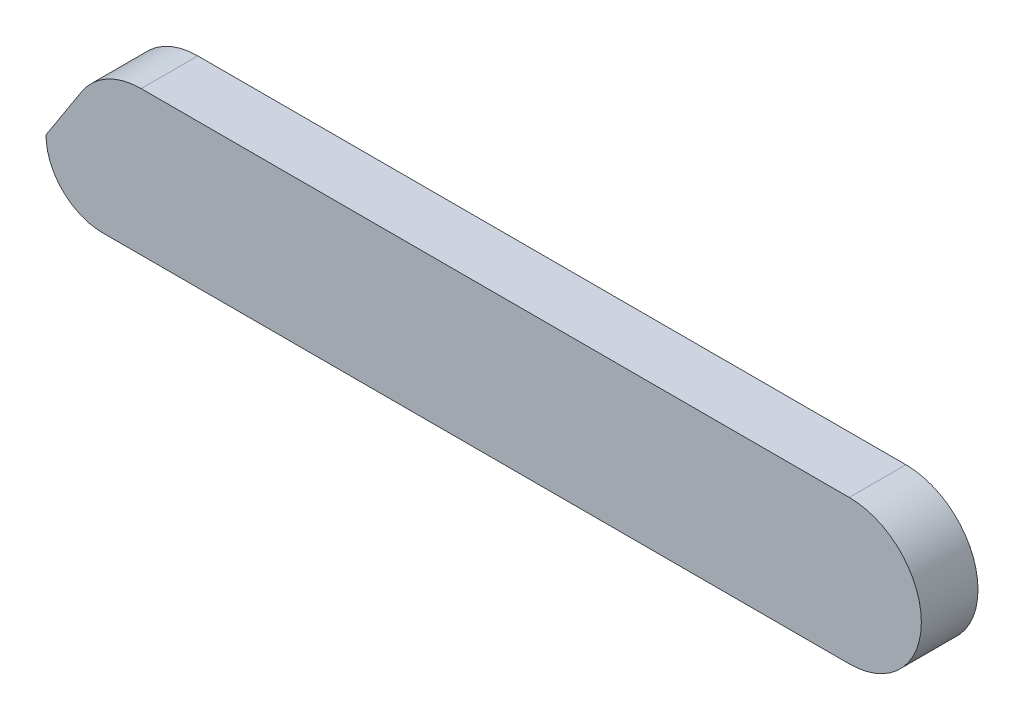
ISO-10303-21;
HEADER;
FILE_DESCRIPTION(('STEP AP214'),'2;1');
FILE_NAME('part.step','',(''),(''),'','','');
FILE_SCHEMA(('AUTOMOTIVE_DESIGN { 1 0 10303 214 1 1 1 1 }'));
ENDSEC;
DATA;
#1=APPLICATION_CONTEXT('core data for automotive mechanical design processes');
#2=APPLICATION_PROTOCOL_DEFINITION('international standard','automotive_design',2000,#1);
#3=PRODUCT_CONTEXT('',#1,'mechanical');
#4=PRODUCT('Part','Part','',(#3));
#5=PRODUCT_RELATED_PRODUCT_CATEGORY('part','',(#4));
#6=PRODUCT_DEFINITION_FORMATION('','',#4);
#7=PRODUCT_DEFINITION_CONTEXT('part definition',#1,'design');
#8=PRODUCT_DEFINITION('design','',#6,#7);
#9=PRODUCT_DEFINITION_SHAPE('','',#8);
#10=(LENGTH_UNIT() NAMED_UNIT(*) SI_UNIT(.MILLI.,.METRE.));
#11=(NAMED_UNIT(*) PLANE_ANGLE_UNIT() SI_UNIT($,.RADIAN.));
#12=(NAMED_UNIT(*) SI_UNIT($,.STERADIAN.) SOLID_ANGLE_UNIT());
#13=UNCERTAINTY_MEASURE_WITH_UNIT(LENGTH_MEASURE(1.E-05),#10,'distance_accuracy_value','');
#14=(GEOMETRIC_REPRESENTATION_CONTEXT(3) GLOBAL_UNCERTAINTY_ASSIGNED_CONTEXT((#13)) GLOBAL_UNIT_ASSIGNED_CONTEXT((#10,
#11,#12)) REPRESENTATION_CONTEXT('',''));
#15=CARTESIAN_POINT('',(0.,0.,0.));
#16=DIRECTION('',(0.,0.,1.));
#17=DIRECTION('',(1.,0.,0.));
#18=AXIS2_PLACEMENT_3D('',#15,#16,#17);
#19=CARTESIAN_POINT('',(49.3162423068997,5.19683770086209,8.));
#20=DIRECTION('',(0.,0.,-1.));
#21=DIRECTION('',(-1.,0.,0.));
#22=AXIS2_PLACEMENT_3D('',#19,#20,#21);
#23=CYLINDRICAL_SURFACE('',#22,10.1799661805025);
#24=CARTESIAN_POINT('',(49.3162423068997,5.19683770086209,0.));
#25=DIRECTION('',(0.,0.,1.));
#26=DIRECTION('',(-1.,0.,0.));
#27=AXIS2_PLACEMENT_3D('',#24,#25,#26);
#28=CIRCLE('',#27,10.1799661805025);
#29=CARTESIAN_POINT('',(49.3162423068997,-4.98312847964037,0.));
#30=VERTEX_POINT('',#29);
#31=CARTESIAN_POINT('',(49.3162423068997,15.3768038813645,0.));
#32=VERTEX_POINT('',#31);
#33=EDGE_CURVE('E123',#30,#32,#28,.T.);
#34=ORIENTED_EDGE('',*,*,#33,.T.);
#35=DIRECTION('',(0.,0.,-1.));
#36=VECTOR('',#35,1.);
#37=CARTESIAN_POINT('',(49.3162423068997,15.3768038813645,8.));
#38=LINE('',#37,#36);
#39=CARTESIAN_POINT('',(49.3162423068997,15.3768038813645,8.));
#40=VERTEX_POINT('',#39);
#41=EDGE_CURVE('E11',#40,#32,#38,.T.);
#42=ORIENTED_EDGE('',*,*,#41,.F.);
#43=CARTESIAN_POINT('',(49.3162423068997,5.19683770086209,8.));
#44=DIRECTION('',(0.,0.,1.));
#45=DIRECTION('',(-1.,0.,0.));
#46=AXIS2_PLACEMENT_3D('',#43,#44,#45);
#47=CIRCLE('',#46,10.1799661805025);
#48=CARTESIAN_POINT('',(49.3162423068997,-4.98312847964037,8.));
#49=VERTEX_POINT('',#48);
#50=EDGE_CURVE('E134',#49,#40,#47,.T.);
#51=ORIENTED_EDGE('',*,*,#50,.F.);
#52=DIRECTION('',(0.,0.,-1.));
#53=VECTOR('',#52,1.);
#54=CARTESIAN_POINT('',(49.3162423068997,-4.98312847964037,8.));
#55=LINE('',#54,#53);
#56=EDGE_CURVE('E119',#49,#30,#55,.T.);
#57=ORIENTED_EDGE('',*,*,#56,.T.);
#58=EDGE_LOOP('',(#34,#42,#51,#57));
#59=FACE_BOUND('',#58,.T.);
#60=ADVANCED_FACE('F39',(#59),#23,.T.);
#61=CARTESIAN_POINT('',(-50.6837576931003,15.3768038813645,8.));
#62=DIRECTION('',(0.,-1.,0.));
#63=DIRECTION('',(0.,0.,-1.));
#64=AXIS2_PLACEMENT_3D('',#61,#62,#63);
#65=PLANE('',#64);
#66=DIRECTION('',(-1.,0.,0.));
#67=VECTOR('',#66,1.);
#68=CARTESIAN_POINT('',(-50.6837576931003,15.3768038813645,0.));
#69=LINE('',#68,#67);
#70=CARTESIAN_POINT('',(-50.6837576931003,15.3768038813645,0.));
#71=VERTEX_POINT('',#70);
#72=EDGE_CURVE('E126',#32,#71,#69,.T.);
#73=ORIENTED_EDGE('',*,*,#72,.T.);
#74=DIRECTION('',(0.,0.,-1.));
#75=VECTOR('',#74,1.);
#76=CARTESIAN_POINT('',(-50.6837576931003,15.3768038813645,8.));
#77=LINE('',#76,#75);
#78=CARTESIAN_POINT('',(-50.6837576931003,15.3768038813645,8.));
#79=VERTEX_POINT('',#78);
#80=EDGE_CURVE('E47',#79,#71,#77,.T.);
#81=ORIENTED_EDGE('',*,*,#80,.F.);
#82=DIRECTION('',(-1.,0.,0.));
#83=VECTOR('',#82,1.);
#84=CARTESIAN_POINT('',(-50.6837576931003,15.3768038813645,8.));
#85=LINE('',#84,#83);
#86=EDGE_CURVE('E92',#40,#79,#85,.T.);
#87=ORIENTED_EDGE('',*,*,#86,.F.);
#88=ORIENTED_EDGE('',*,*,#41,.T.);
#89=EDGE_LOOP('',(#73,#81,#87,#88));
#90=FACE_BOUND('',#89,.T.);
#91=ADVANCED_FACE('F162',(#90),#65,.F.);
#92=CARTESIAN_POINT('',(-50.6837576931003,5.37680388136454,8.));
#93=DIRECTION('',(0.,0.,-1.));
#94=DIRECTION('',(-1.,0.,0.));
#95=AXIS2_PLACEMENT_3D('',#92,#93,#94);
#96=CYLINDRICAL_SURFACE('',#95,10.);
#97=CARTESIAN_POINT('',(-50.6837576931003,5.37680388136454,0.));
#98=DIRECTION('',(0.,0.,1.));
#99=DIRECTION('',(1.,0.,0.));
#100=AXIS2_PLACEMENT_3D('',#97,#98,#99);
#101=CIRCLE('',#100,10.);
#102=CARTESIAN_POINT('',(-59.0834456296703,10.8031509554319,0.));
#103=VERTEX_POINT('',#102);
#104=EDGE_CURVE('E129',#71,#103,#101,.T.);
#105=ORIENTED_EDGE('',*,*,#104,.T.);
#106=DIRECTION('',(0.,0.,-1.));
#107=VECTOR('',#106,1.);
#108=CARTESIAN_POINT('',(-59.0834456296703,10.8031509554319,8.));
#109=LINE('',#108,#107);
#110=CARTESIAN_POINT('',(-59.0834456296703,10.8031509554319,8.));
#111=VERTEX_POINT('',#110);
#112=EDGE_CURVE('E114',#111,#103,#109,.T.);
#113=ORIENTED_EDGE('',*,*,#112,.F.);
#114=CARTESIAN_POINT('',(-50.6837576931003,5.37680388136454,8.));
#115=DIRECTION('',(0.,0.,1.));
#116=DIRECTION('',(1.,0.,0.));
#117=AXIS2_PLACEMENT_3D('',#114,#115,#116);
#118=CIRCLE('',#117,10.);
#119=EDGE_CURVE('E105',#79,#111,#118,.T.);
#120=ORIENTED_EDGE('',*,*,#119,.F.);
#121=ORIENTED_EDGE('',*,*,#80,.T.);
#122=EDGE_LOOP('',(#105,#113,#120,#121));
#123=FACE_BOUND('',#122,.T.);
#124=ADVANCED_FACE('F140',(#123),#96,.T.);
#125=CARTESIAN_POINT('',(-64.1195110315933,3.00759766204438,8.));
#126=DIRECTION('',(0.839968793657005,-0.542634707406738,0.));
#127=DIRECTION('',(0.542634707406738,0.839968793657005,0.));
#128=AXIS2_PLACEMENT_3D('',#125,#126,#127);
#129=PLANE('',#128);
#130=DIRECTION('',(-0.542634707406738,-0.839968793657005,0.));
#131=VECTOR('',#130,1.);
#132=CARTESIAN_POINT('',(-64.1195110315933,3.00759766204438,0.));
#133=LINE('',#132,#131);
#134=CARTESIAN_POINT('',(-64.1195110315933,3.00759766204438,0.));
#135=VERTEX_POINT('',#134);
#136=EDGE_CURVE('E113',#103,#135,#133,.T.);
#137=ORIENTED_EDGE('',*,*,#136,.T.);
#138=DIRECTION('',(0.,0.,-1.));
#139=VECTOR('',#138,1.);
#140=CARTESIAN_POINT('',(-64.1195110315933,3.00759766204438,8.));
#141=LINE('',#140,#139);
#142=CARTESIAN_POINT('',(-64.1195110315933,3.00759766204438,8.));
#143=VERTEX_POINT('',#142);
#144=EDGE_CURVE('E110',#143,#135,#141,.T.);
#145=ORIENTED_EDGE('',*,*,#144,.F.);
#146=DIRECTION('',(-0.542634707406738,-0.839968793657005,0.));
#147=VECTOR('',#146,1.);
#148=CARTESIAN_POINT('',(-64.1195110315933,3.00759766204438,8.));
#149=LINE('',#148,#147);
#150=EDGE_CURVE('E99',#111,#143,#149,.T.);
#151=ORIENTED_EDGE('',*,*,#150,.F.);
#152=ORIENTED_EDGE('',*,*,#112,.T.);
#153=EDGE_LOOP('',(#137,#145,#151,#152));
#154=FACE_BOUND('',#153,.T.);
#155=ADVANCED_FACE('F111',(#154),#129,.F.);
#156=CARTESIAN_POINT('',(-56.1287848899085,3.00759766204434,8.));
#157=DIRECTION('',(0.,0.,-1.));
#158=DIRECTION('',(-1.,0.,0.));
#159=AXIS2_PLACEMENT_3D('',#156,#157,#158);
#160=CYLINDRICAL_SURFACE('',#159,7.99072614168473);
#161=CARTESIAN_POINT('',(-56.1287848899085,3.00759766204434,0.));
#162=DIRECTION('',(0.,0.,1.));
#163=DIRECTION('',(-1.,0.,0.));
#164=AXIS2_PLACEMENT_3D('',#161,#162,#163);
#165=CIRCLE('',#164,7.99072614168473);
#166=CARTESIAN_POINT('',(-56.1287848899085,-4.98312847964039,0.));
#167=VERTEX_POINT('',#166);
#168=EDGE_CURVE('E78',#135,#167,#165,.T.);
#169=ORIENTED_EDGE('',*,*,#168,.T.);
#170=DIRECTION('',(0.,0.,-1.));
#171=VECTOR('',#170,1.);
#172=CARTESIAN_POINT('',(-56.1287848899085,-4.98312847964039,8.));
#173=LINE('',#172,#171);
#174=CARTESIAN_POINT('',(-56.1287848899085,-4.98312847964039,8.));
#175=VERTEX_POINT('',#174);
#176=EDGE_CURVE('E115',#175,#167,#173,.T.);
#177=ORIENTED_EDGE('',*,*,#176,.F.);
#178=CARTESIAN_POINT('',(-56.1287848899085,3.00759766204434,8.));
#179=DIRECTION('',(0.,0.,1.));
#180=DIRECTION('',(-1.,0.,0.));
#181=AXIS2_PLACEMENT_3D('',#178,#179,#180);
#182=CIRCLE('',#181,7.99072614168473);
#183=EDGE_CURVE('E103',#143,#175,#182,.T.);
#184=ORIENTED_EDGE('',*,*,#183,.F.);
#185=ORIENTED_EDGE('',*,*,#144,.T.);
#186=EDGE_LOOP('',(#169,#177,#184,#185));
#187=FACE_BOUND('',#186,.T.);
#188=ADVANCED_FACE('F117',(#187),#160,.T.);
#189=CARTESIAN_POINT('',(49.3162423068997,-4.98312847964037,8.));
#190=DIRECTION('',(0.,1.,0.));
#191=DIRECTION('',(-1.,0.,0.));
#192=AXIS2_PLACEMENT_3D('',#189,#190,#191);
#193=PLANE('',#192);
#194=CARTESIAN_POINT('',(-53.2798229165995,-4.98312847964039,4.));
#195=DIRECTION('',(0.,-1.,0.));
#196=DIRECTION('',(1.,0.,0.));
#197=AXIS2_PLACEMENT_3D('',#194,#195,#196);
#198=CIRCLE('',#197,2.55);
#199=CARTESIAN_POINT('',(-50.7298229165995,-4.98312847964039,4.));
#200=VERTEX_POINT('',#199);
#201=EDGE_CURVE('E216',#200,#200,#198,.T.);
#202=ORIENTED_EDGE('',*,*,#201,.F.);
#203=EDGE_LOOP('',(#202));
#204=FACE_BOUND('',#203,.T.);
#205=DIRECTION('',(1.,0.,0.));
#206=VECTOR('',#205,1.);
#207=CARTESIAN_POINT('',(49.3162423068997,-4.98312847964037,0.));
#208=LINE('',#207,#206);
#209=EDGE_CURVE('E84',#167,#30,#208,.T.);
#210=ORIENTED_EDGE('',*,*,#209,.T.);
#211=ORIENTED_EDGE('',*,*,#56,.F.);
#212=DIRECTION('',(1.,0.,0.));
#213=VECTOR('',#212,1.);
#214=CARTESIAN_POINT('',(49.3162423068997,-4.98312847964037,8.));
#215=LINE('',#214,#213);
#216=EDGE_CURVE('E55',#175,#49,#215,.T.);
#217=ORIENTED_EDGE('',*,*,#216,.F.);
#218=ORIENTED_EDGE('',*,*,#176,.T.);
#219=EDGE_LOOP('',(#210,#211,#217,#218));
#220=FACE_BOUND('',#219,.T.);
#221=ADVANCED_FACE('F147',(#204,#220),#193,.F.);
#222=CARTESIAN_POINT('',(49.3162423068997,5.19683770086209,8.));
#223=DIRECTION('',(0.,0.,-1.));
#224=DIRECTION('',(-1.,0.,0.));
#225=AXIS2_PLACEMENT_3D('',#222,#223,#224);
#226=PLANE('',#225);
#227=ORIENTED_EDGE('',*,*,#50,.T.);
#228=ORIENTED_EDGE('',*,*,#86,.T.);
#229=ORIENTED_EDGE('',*,*,#119,.T.);
#230=ORIENTED_EDGE('',*,*,#150,.T.);
#231=ORIENTED_EDGE('',*,*,#183,.T.);
#232=ORIENTED_EDGE('',*,*,#216,.T.);
#233=EDGE_LOOP('',(#227,#228,#229,#230,#231,#232));
#234=FACE_BOUND('',#233,.T.);
#235=ADVANCED_FACE('F101',(#234),#226,.F.);
#236=CARTESIAN_POINT('',(49.3162423068997,5.19683770086209,0.));
#237=DIRECTION('',(0.,0.,-1.));
#238=DIRECTION('',(-1.,0.,0.));
#239=AXIS2_PLACEMENT_3D('',#236,#237,#238);
#240=PLANE('',#239);
#241=ORIENTED_EDGE('',*,*,#33,.F.);
#242=ORIENTED_EDGE('',*,*,#209,.F.);
#243=ORIENTED_EDGE('',*,*,#168,.F.);
#244=ORIENTED_EDGE('',*,*,#136,.F.);
#245=ORIENTED_EDGE('',*,*,#104,.F.);
#246=ORIENTED_EDGE('',*,*,#72,.F.);
#247=EDGE_LOOP('',(#241,#242,#243,#244,#245,#246));
#248=FACE_BOUND('',#247,.T.);
#249=ADVANCED_FACE('F143',(#248),#240,.T.);
#250=CARTESIAN_POINT('',(-53.2798229165995,2.01687152035961,4.));
#251=DIRECTION('',(0.,-1.,0.));
#252=DIRECTION('',(1.,0.,0.));
#253=AXIS2_PLACEMENT_3D('',#250,#251,#252);
#254=CYLINDRICAL_SURFACE('',#253,2.55);
#255=CARTESIAN_POINT('',(-53.2798229165995,2.01687152035961,4.));
#256=DIRECTION('',(0.,-1.,0.));
#257=DIRECTION('',(1.,0.,0.));
#258=AXIS2_PLACEMENT_3D('',#255,#256,#257);
#259=CIRCLE('',#258,2.55);
#260=CARTESIAN_POINT('',(-50.7298229165995,2.01687152035961,4.));
#261=VERTEX_POINT('',#260);
#262=EDGE_CURVE('E127',#261,#261,#259,.T.);
#263=ORIENTED_EDGE('',*,*,#262,.F.);
#264=EDGE_LOOP('',(#263));
#265=FACE_BOUND('',#264,.T.);
#266=ORIENTED_EDGE('',*,*,#201,.T.);
#267=EDGE_LOOP('',(#266));
#268=FACE_BOUND('',#267,.T.);
#269=ADVANCED_FACE('F191',(#265,#268),#254,.F.);
#270=CARTESIAN_POINT('',(-53.2798229165995,2.01687152035961,4.));
#271=DIRECTION('',(0.,-1.,0.));
#272=DIRECTION('',(1.,0.,0.));
#273=AXIS2_PLACEMENT_3D('',#270,#271,#272);
#274=PLANE('',#273);
#275=ORIENTED_EDGE('',*,*,#262,.T.);
#276=EDGE_LOOP('',(#275));
#277=FACE_BOUND('',#276,.T.);
#278=ADVANCED_FACE('F201',(#277),#274,.T.);
#279=CLOSED_SHELL('',(#60,#91,#124,#155,#188,#221,#235,#249,#269,#278));
#280=MANIFOLD_SOLID_BREP('B2',#279);
#281=ADVANCED_BREP_SHAPE_REPRESENTATION('',(#18,#280),#14);
#282=SHAPE_DEFINITION_REPRESENTATION(#9,#281);
ENDSEC;
END-ISO-10303-21;
